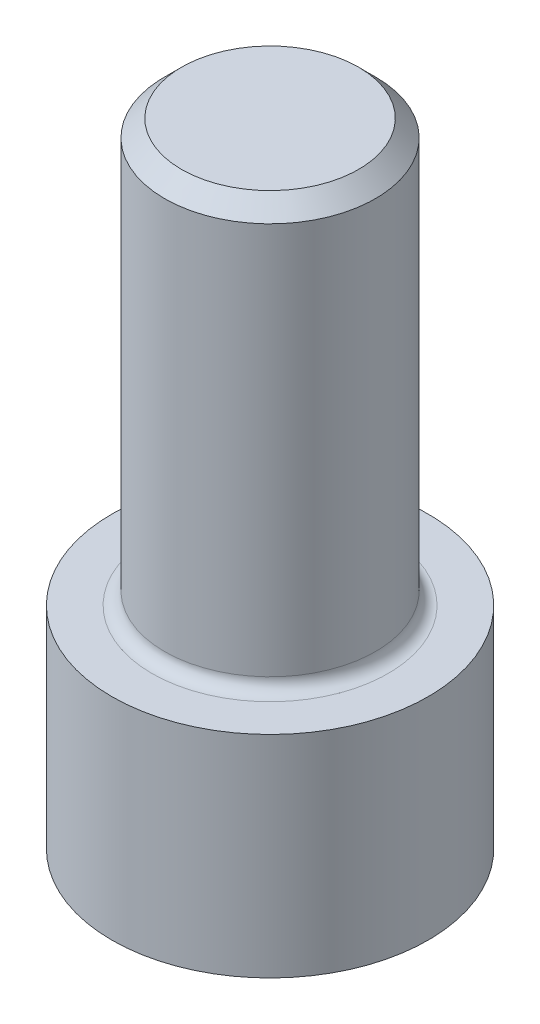
ISO-10303-21;
HEADER;
FILE_DESCRIPTION(('STEP AP214'),'2;1');
FILE_NAME('part.step','',(''),(''),'','','');
FILE_SCHEMA(('AUTOMOTIVE_DESIGN { 1 0 10303 214 1 1 1 1 }'));
ENDSEC;
DATA;
#1=APPLICATION_CONTEXT('core data for automotive mechanical design processes');
#2=APPLICATION_PROTOCOL_DEFINITION('international standard','automotive_design',2000,#1);
#3=PRODUCT_CONTEXT('',#1,'mechanical');
#4=PRODUCT('Part','Part','',(#3));
#5=PRODUCT_RELATED_PRODUCT_CATEGORY('part','',(#4));
#6=PRODUCT_DEFINITION_FORMATION('','',#4);
#7=PRODUCT_DEFINITION_CONTEXT('part definition',#1,'design');
#8=PRODUCT_DEFINITION('design','',#6,#7);
#9=PRODUCT_DEFINITION_SHAPE('','',#8);
#10=(LENGTH_UNIT() NAMED_UNIT(*) SI_UNIT(.MILLI.,.METRE.));
#11=(NAMED_UNIT(*) PLANE_ANGLE_UNIT() SI_UNIT($,.RADIAN.));
#12=(NAMED_UNIT(*) SI_UNIT($,.STERADIAN.) SOLID_ANGLE_UNIT());
#13=UNCERTAINTY_MEASURE_WITH_UNIT(LENGTH_MEASURE(1.E-05),#10,'distance_accuracy_value','');
#14=(GEOMETRIC_REPRESENTATION_CONTEXT(3) GLOBAL_UNCERTAINTY_ASSIGNED_CONTEXT((#13)) GLOBAL_UNIT_ASSIGNED_CONTEXT((#10,
#11,#12)) REPRESENTATION_CONTEXT('',''));
#15=CARTESIAN_POINT('',(0.,0.,0.));
#16=DIRECTION('',(0.,0.,1.));
#17=DIRECTION('',(1.,0.,0.));
#18=AXIS2_PLACEMENT_3D('',#15,#16,#17);
#19=CARTESIAN_POINT('',(0.,0.25,0.));
#20=DIRECTION('',(0.,-1.,0.));
#21=DIRECTION('',(0.,0.,-1.));
#22=AXIS2_PLACEMENT_3D('',#19,#20,#21);
#23=CYLINDRICAL_SURFACE('',#22,0.1875);
#24=CARTESIAN_POINT('',(0.,0.25,0.));
#25=DIRECTION('',(0.,1.,0.));
#26=DIRECTION('',(0.,0.,1.));
#27=AXIS2_PLACEMENT_3D('',#24,#25,#26);
#28=CIRCLE('',#27,0.1875);
#29=CARTESIAN_POINT('',(0.,0.25,0.1875));
#30=VERTEX_POINT('',#29);
#31=EDGE_CURVE('E167',#30,#30,#28,.T.);
#32=ORIENTED_EDGE('',*,*,#31,.F.);
#33=EDGE_LOOP('',(#32));
#34=FACE_BOUND('',#33,.T.);
#35=CARTESIAN_POINT('',(0.,0.,0.));
#36=DIRECTION('',(0.,1.,0.));
#37=DIRECTION('',(0.,0.,1.));
#38=AXIS2_PLACEMENT_3D('',#35,#36,#37);
#39=CIRCLE('',#38,0.1875);
#40=CARTESIAN_POINT('',(0.,0.,0.1875));
#41=VERTEX_POINT('',#40);
#42=EDGE_CURVE('E157',#41,#41,#39,.T.);
#43=ORIENTED_EDGE('',*,*,#42,.T.);
#44=EDGE_LOOP('',(#43));
#45=FACE_BOUND('',#44,.T.);
#46=ADVANCED_FACE('F41',(#34,#45),#23,.T.);
#47=CARTESIAN_POINT('',(0.,0.25,0.));
#48=DIRECTION('',(0.,1.,0.));
#49=DIRECTION('',(0.,0.,1.));
#50=AXIS2_PLACEMENT_3D('',#47,#48,#49);
#51=PLANE('',#50);
#52=CARTESIAN_POINT('',(0.,0.25,0.));
#53=DIRECTION('',(0.,1.,0.));
#54=DIRECTION('',(0.,0.,1.));
#55=AXIS2_PLACEMENT_3D('',#52,#53,#54);
#56=CIRCLE('',#55,0.14);
#57=CARTESIAN_POINT('',(0.,0.25,0.14));
#58=VERTEX_POINT('',#57);
#59=EDGE_CURVE('E178',#58,#58,#56,.F.);
#60=ORIENTED_EDGE('',*,*,#59,.T.);
#61=EDGE_LOOP('',(#60));
#62=FACE_BOUND('',#61,.T.);
#63=ORIENTED_EDGE('',*,*,#31,.T.);
#64=EDGE_LOOP('',(#63));
#65=FACE_BOUND('',#64,.T.);
#66=ADVANCED_FACE('F200',(#62,#65),#51,.T.);
#67=CARTESIAN_POINT('',(0.,0.,0.));
#68=DIRECTION('',(0.,1.,0.));
#69=DIRECTION('',(0.,0.,1.));
#70=AXIS2_PLACEMENT_3D('',#67,#68,#69);
#71=PLANE('',#70);
#72=DIRECTION('',(-0.0187363075382977,0.,0.999824459982766));
#73=VECTOR('',#72,1.);
#74=CARTESIAN_POINT('',(0.0875241535439282,0.,-0.0483686111690099));
#75=LINE('',#74,#73);
#76=CARTESIAN_POINT('',(0.0875241535439282,0.,-0.04836861116901));
#77=VERTEX_POINT('',#76);
#78=CARTESIAN_POINT('',(0.0856505227900985,0.,0.0516138348292667));
#79=VERTEX_POINT('',#78);
#80=EDGE_CURVE('E138',#77,#79,#75,.T.);
#81=ORIENTED_EDGE('',*,*,#80,.F.);
#82=DIRECTION('',(0.856505227900985,0.,0.516138348292667));
#83=VECTOR('',#82,1.);
#84=CARTESIAN_POINT('',(0.00187363075382977,0.,-0.0999824459982766));
#85=LINE('',#84,#83);
#86=CARTESIAN_POINT('',(0.00187363075382977,0.,-0.0999824459982766));
#87=VERTEX_POINT('',#86);
#88=EDGE_CURVE('E58',#87,#77,#85,.T.);
#89=ORIENTED_EDGE('',*,*,#88,.F.);
#90=DIRECTION('',(0.875241535439282,0.,-0.483686111690099));
#91=VECTOR('',#90,1.);
#92=CARTESIAN_POINT('',(-0.0856505227900985,0.,-0.0516138348292667));
#93=LINE('',#92,#91);
#94=CARTESIAN_POINT('',(-0.0856505227900985,0.,-0.0516138348292667));
#95=VERTEX_POINT('',#94);
#96=EDGE_CURVE('E151',#95,#87,#93,.T.);
#97=ORIENTED_EDGE('',*,*,#96,.F.);
#98=DIRECTION('',(0.0187363075382977,0.,-0.999824459982766));
#99=VECTOR('',#98,1.);
#100=CARTESIAN_POINT('',(-0.0875241535439282,0.,0.04836861116901));
#101=LINE('',#100,#99);
#102=CARTESIAN_POINT('',(-0.0875241535439282,0.,0.04836861116901));
#103=VERTEX_POINT('',#102);
#104=EDGE_CURVE('E148',#103,#95,#101,.T.);
#105=ORIENTED_EDGE('',*,*,#104,.F.);
#106=DIRECTION('',(-0.856505227900985,0.,-0.516138348292667));
#107=VECTOR('',#106,1.);
#108=CARTESIAN_POINT('',(-0.00187363075382976,0.,0.0999824459982766));
#109=LINE('',#108,#107);
#110=CARTESIAN_POINT('',(-0.00187363075382976,0.,0.0999824459982766));
#111=VERTEX_POINT('',#110);
#112=EDGE_CURVE('E106',#111,#103,#109,.T.);
#113=ORIENTED_EDGE('',*,*,#112,.F.);
#114=DIRECTION('',(-0.875241535439282,0.,0.4836861116901));
#115=VECTOR('',#114,1.);
#116=CARTESIAN_POINT('',(0.0856505227900985,0.,0.0516138348292667));
#117=LINE('',#116,#115);
#118=EDGE_CURVE('E142',#79,#111,#117,.T.);
#119=ORIENTED_EDGE('',*,*,#118,.F.);
#120=EDGE_LOOP('',(#81,#89,#97,#105,#113,#119));
#121=FACE_BOUND('',#120,.T.);
#122=ORIENTED_EDGE('',*,*,#42,.F.);
#123=EDGE_LOOP('',(#122));
#124=FACE_BOUND('',#123,.T.);
#125=ADVANCED_FACE('F206',(#121,#124),#71,.F.);
#126=CARTESIAN_POINT('',(0.,0.75,0.));
#127=DIRECTION('',(0.,-1.,0.));
#128=DIRECTION('',(0.,0.,-1.));
#129=AXIS2_PLACEMENT_3D('',#126,#127,#128);
#130=CYLINDRICAL_SURFACE('',#129,0.125);
#131=CARTESIAN_POINT('',(0.,0.73,0.));
#132=DIRECTION('',(0.,1.,0.));
#133=DIRECTION('',(0.,0.,1.));
#134=AXIS2_PLACEMENT_3D('',#131,#132,#133);
#135=CIRCLE('',#134,0.125);
#136=CARTESIAN_POINT('',(0.,0.73,0.125));
#137=VERTEX_POINT('',#136);
#138=EDGE_CURVE('E11',#137,#137,#135,.F.);
#139=ORIENTED_EDGE('',*,*,#138,.T.);
#140=EDGE_LOOP('',(#139));
#141=FACE_BOUND('',#140,.T.);
#142=CARTESIAN_POINT('',(0.,0.265,0.));
#143=DIRECTION('',(0.,1.,0.));
#144=DIRECTION('',(0.,0.,1.));
#145=AXIS2_PLACEMENT_3D('',#142,#143,#144);
#146=CIRCLE('',#145,0.125);
#147=CARTESIAN_POINT('',(0.,0.265,0.125));
#148=VERTEX_POINT('',#147);
#149=EDGE_CURVE('E171',#148,#148,#146,.T.);
#150=ORIENTED_EDGE('',*,*,#149,.T.);
#151=EDGE_LOOP('',(#150));
#152=FACE_BOUND('',#151,.T.);
#153=ADVANCED_FACE('F213',(#141,#152),#130,.T.);
#154=CARTESIAN_POINT('',(0.,0.75,0.));
#155=DIRECTION('',(0.,1.,0.));
#156=DIRECTION('',(0.,0.,1.));
#157=AXIS2_PLACEMENT_3D('',#154,#155,#156);
#158=PLANE('',#157);
#159=CARTESIAN_POINT('',(0.,0.75,0.));
#160=DIRECTION('',(0.,1.,0.));
#161=DIRECTION('',(0.,0.,1.));
#162=AXIS2_PLACEMENT_3D('',#159,#160,#161);
#163=CIRCLE('',#162,0.105);
#164=CARTESIAN_POINT('',(0.,0.75,0.105));
#165=VERTEX_POINT('',#164);
#166=EDGE_CURVE('E51',#165,#165,#163,.T.);
#167=ORIENTED_EDGE('',*,*,#166,.T.);
#168=EDGE_LOOP('',(#167));
#169=FACE_BOUND('',#168,.T.);
#170=ADVANCED_FACE('F185',(#169),#158,.T.);
#171=CARTESIAN_POINT('',(0.,0.265,0.));
#172=DIRECTION('',(0.,1.,0.));
#173=DIRECTION('',(0.,0.,1.));
#174=AXIS2_PLACEMENT_3D('',#171,#172,#173);
#175=TOROIDAL_SURFACE('',#174,0.14,0.015);
#176=ORIENTED_EDGE('',*,*,#59,.F.);
#177=EDGE_LOOP('',(#176));
#178=FACE_BOUND('',#177,.T.);
#179=ORIENTED_EDGE('',*,*,#149,.F.);
#180=EDGE_LOOP('',(#179));
#181=FACE_BOUND('',#180,.T.);
#182=ADVANCED_FACE('F189',(#178,#181),#175,.F.);
#183=CARTESIAN_POINT('',(0.,0.75,0.));
#184=DIRECTION('',(0.,-1.,0.));
#185=DIRECTION('',(0.,0.,-1.));
#186=AXIS2_PLACEMENT_3D('',#183,#184,#185);
#187=CONICAL_SURFACE('',#186,0.105,0.785398163397448);
#188=ORIENTED_EDGE('',*,*,#138,.F.);
#189=EDGE_LOOP('',(#188));
#190=FACE_BOUND('',#189,.T.);
#191=ORIENTED_EDGE('',*,*,#166,.F.);
#192=EDGE_LOOP('',(#191));
#193=FACE_BOUND('',#192,.T.);
#194=ADVANCED_FACE('F44',(#190,#193),#187,.T.);
#195=CARTESIAN_POINT('',(0.00187363075382977,0.15,-0.0999824459982766));
#196=DIRECTION('',(0.516138348292667,0.,-0.856505227900985));
#197=DIRECTION('',(-0.856505227900985,0.,-0.516138348292667));
#198=AXIS2_PLACEMENT_3D('',#195,#196,#197);
#199=PLANE('',#198);
#200=ORIENTED_EDGE('',*,*,#88,.T.);
#201=DIRECTION('',(0.,-1.,0.));
#202=VECTOR('',#201,1.);
#203=CARTESIAN_POINT('',(0.0875241535439282,0.15,-0.0483686111690099));
#204=LINE('',#203,#202);
#205=CARTESIAN_POINT('',(0.0875241535439282,0.15,-0.0483686111690099));
#206=VERTEX_POINT('',#205);
#207=EDGE_CURVE('E88',#206,#77,#204,.T.);
#208=ORIENTED_EDGE('',*,*,#207,.F.);
#209=DIRECTION('',(0.856505227900985,0.,0.516138348292667));
#210=VECTOR('',#209,1.);
#211=CARTESIAN_POINT('',(0.00187363075382977,0.15,-0.0999824459982766));
#212=LINE('',#211,#210);
#213=CARTESIAN_POINT('',(0.00187363075382977,0.15,-0.0999824459982766));
#214=VERTEX_POINT('',#213);
#215=EDGE_CURVE('E154',#214,#206,#212,.T.);
#216=ORIENTED_EDGE('',*,*,#215,.F.);
#217=DIRECTION('',(0.,-1.,0.));
#218=VECTOR('',#217,1.);
#219=CARTESIAN_POINT('',(0.00187363075382977,0.15,-0.0999824459982766));
#220=LINE('',#219,#218);
#221=EDGE_CURVE('E66',#214,#87,#220,.T.);
#222=ORIENTED_EDGE('',*,*,#221,.T.);
#223=EDGE_LOOP('',(#200,#208,#216,#222));
#224=FACE_BOUND('',#223,.T.);
#225=ADVANCED_FACE('F188',(#224),#199,.F.);
#226=CARTESIAN_POINT('',(-0.0856505227900985,0.15,-0.0516138348292667));
#227=DIRECTION('',(-0.4836861116901,0.,-0.875241535439282));
#228=DIRECTION('',(-0.875241535439282,0.,0.4836861116901));
#229=AXIS2_PLACEMENT_3D('',#226,#227,#228);
#230=PLANE('',#229);
#231=ORIENTED_EDGE('',*,*,#96,.T.);
#232=ORIENTED_EDGE('',*,*,#221,.F.);
#233=DIRECTION('',(0.875241535439282,0.,-0.483686111690099));
#234=VECTOR('',#233,1.);
#235=CARTESIAN_POINT('',(-0.0856505227900985,0.15,-0.0516138348292667));
#236=LINE('',#235,#234);
#237=CARTESIAN_POINT('',(-0.0856505227900985,0.15,-0.0516138348292667));
#238=VERTEX_POINT('',#237);
#239=EDGE_CURVE('E120',#238,#214,#236,.T.);
#240=ORIENTED_EDGE('',*,*,#239,.F.);
#241=DIRECTION('',(0.,-1.,0.));
#242=VECTOR('',#241,1.);
#243=CARTESIAN_POINT('',(-0.0856505227900985,0.15,-0.0516138348292667));
#244=LINE('',#243,#242);
#245=EDGE_CURVE('E111',#238,#95,#244,.T.);
#246=ORIENTED_EDGE('',*,*,#245,.T.);
#247=EDGE_LOOP('',(#231,#232,#240,#246));
#248=FACE_BOUND('',#247,.T.);
#249=ADVANCED_FACE('F195',(#248),#230,.F.);
#250=CARTESIAN_POINT('',(-0.0875241535439282,0.15,0.04836861116901));
#251=DIRECTION('',(-0.999824459982766,0.,-0.0187363075382977));
#252=DIRECTION('',(-0.0187363075382977,0.,0.999824459982766));
#253=AXIS2_PLACEMENT_3D('',#250,#251,#252);
#254=PLANE('',#253);
#255=ORIENTED_EDGE('',*,*,#104,.T.);
#256=ORIENTED_EDGE('',*,*,#245,.F.);
#257=DIRECTION('',(0.0187363075382977,0.,-0.999824459982766));
#258=VECTOR('',#257,1.);
#259=CARTESIAN_POINT('',(-0.0875241535439282,0.15,0.04836861116901));
#260=LINE('',#259,#258);
#261=CARTESIAN_POINT('',(-0.0875241535439282,0.15,0.04836861116901));
#262=VERTEX_POINT('',#261);
#263=EDGE_CURVE('E115',#262,#238,#260,.T.);
#264=ORIENTED_EDGE('',*,*,#263,.F.);
#265=DIRECTION('',(0.,-1.,0.));
#266=VECTOR('',#265,1.);
#267=CARTESIAN_POINT('',(-0.0875241535439282,0.15,0.04836861116901));
#268=LINE('',#267,#266);
#269=EDGE_CURVE('E99',#262,#103,#268,.T.);
#270=ORIENTED_EDGE('',*,*,#269,.T.);
#271=EDGE_LOOP('',(#255,#256,#264,#270));
#272=FACE_BOUND('',#271,.T.);
#273=ADVANCED_FACE('F116',(#272),#254,.F.);
#274=CARTESIAN_POINT('',(-0.00187363075382976,0.15,0.0999824459982766));
#275=DIRECTION('',(-0.516138348292667,0.,0.856505227900985));
#276=DIRECTION('',(0.856505227900985,0.,0.516138348292667));
#277=AXIS2_PLACEMENT_3D('',#274,#275,#276);
#278=PLANE('',#277);
#279=ORIENTED_EDGE('',*,*,#112,.T.);
#280=ORIENTED_EDGE('',*,*,#269,.F.);
#281=DIRECTION('',(-0.856505227900985,0.,-0.516138348292667));
#282=VECTOR('',#281,1.);
#283=CARTESIAN_POINT('',(-0.00187363075382976,0.15,0.0999824459982766));
#284=LINE('',#283,#282);
#285=CARTESIAN_POINT('',(-0.00187363075382976,0.15,0.0999824459982766));
#286=VERTEX_POINT('',#285);
#287=EDGE_CURVE('E103',#286,#262,#284,.T.);
#288=ORIENTED_EDGE('',*,*,#287,.F.);
#289=DIRECTION('',(0.,-1.,0.));
#290=VECTOR('',#289,1.);
#291=CARTESIAN_POINT('',(-0.00187363075382976,0.15,0.0999824459982766));
#292=LINE('',#291,#290);
#293=EDGE_CURVE('E112',#286,#111,#292,.T.);
#294=ORIENTED_EDGE('',*,*,#293,.T.);
#295=EDGE_LOOP('',(#279,#280,#288,#294));
#296=FACE_BOUND('',#295,.T.);
#297=ADVANCED_FACE('F101',(#296),#278,.F.);
#298=CARTESIAN_POINT('',(0.0856505227900985,0.15,0.0516138348292667));
#299=DIRECTION('',(0.4836861116901,0.,0.875241535439282));
#300=DIRECTION('',(0.875241535439282,0.,-0.4836861116901));
#301=AXIS2_PLACEMENT_3D('',#298,#299,#300);
#302=PLANE('',#301);
#303=ORIENTED_EDGE('',*,*,#118,.T.);
#304=ORIENTED_EDGE('',*,*,#293,.F.);
#305=DIRECTION('',(-0.875241535439282,0.,0.4836861116901));
#306=VECTOR('',#305,1.);
#307=CARTESIAN_POINT('',(0.0856505227900985,0.15,0.0516138348292667));
#308=LINE('',#307,#306);
#309=CARTESIAN_POINT('',(0.0856505227900985,0.15,0.0516138348292667));
#310=VERTEX_POINT('',#309);
#311=EDGE_CURVE('E126',#310,#286,#308,.T.);
#312=ORIENTED_EDGE('',*,*,#311,.F.);
#313=DIRECTION('',(0.,-1.,0.));
#314=VECTOR('',#313,1.);
#315=CARTESIAN_POINT('',(0.0856505227900985,0.15,0.0516138348292667));
#316=LINE('',#315,#314);
#317=EDGE_CURVE('E162',#310,#79,#316,.T.);
#318=ORIENTED_EDGE('',*,*,#317,.T.);
#319=EDGE_LOOP('',(#303,#304,#312,#318));
#320=FACE_BOUND('',#319,.T.);
#321=ADVANCED_FACE('F224',(#320),#302,.F.);
#322=CARTESIAN_POINT('',(0.0875241535439282,0.15,-0.0483686111690099));
#323=DIRECTION('',(0.999824459982766,0.,0.0187363075382977));
#324=DIRECTION('',(0.0187363075382977,0.,-0.999824459982766));
#325=AXIS2_PLACEMENT_3D('',#322,#323,#324);
#326=PLANE('',#325);
#327=ORIENTED_EDGE('',*,*,#80,.T.);
#328=ORIENTED_EDGE('',*,*,#317,.F.);
#329=DIRECTION('',(-0.0187363075382977,0.,0.999824459982766));
#330=VECTOR('',#329,1.);
#331=CARTESIAN_POINT('',(0.0875241535439282,0.15,-0.0483686111690099));
#332=LINE('',#331,#330);
#333=EDGE_CURVE('E130',#206,#310,#332,.T.);
#334=ORIENTED_EDGE('',*,*,#333,.F.);
#335=ORIENTED_EDGE('',*,*,#207,.T.);
#336=EDGE_LOOP('',(#327,#328,#334,#335));
#337=FACE_BOUND('',#336,.T.);
#338=ADVANCED_FACE('F221',(#337),#326,.F.);
#339=CARTESIAN_POINT('',(0.,0.15,0.));
#340=DIRECTION('',(0.,-1.,0.));
#341=DIRECTION('',(0.,0.,-1.));
#342=AXIS2_PLACEMENT_3D('',#339,#340,#341);
#343=PLANE('',#342);
#344=ORIENTED_EDGE('',*,*,#215,.T.);
#345=ORIENTED_EDGE('',*,*,#333,.T.);
#346=ORIENTED_EDGE('',*,*,#311,.T.);
#347=ORIENTED_EDGE('',*,*,#287,.T.);
#348=ORIENTED_EDGE('',*,*,#263,.T.);
#349=ORIENTED_EDGE('',*,*,#239,.T.);
#350=EDGE_LOOP('',(#344,#345,#346,#347,#348,#349));
#351=FACE_BOUND('',#350,.T.);
#352=ADVANCED_FACE('F123',(#351),#343,.T.);
#353=CLOSED_SHELL('',(#46,#66,#125,#153,#170,#182,#194,#225,#249,#273,#297,#321,#338,#352));
#354=MANIFOLD_SOLID_BREP('B2',#353);
#355=ADVANCED_BREP_SHAPE_REPRESENTATION('',(#18,#354),#14);
#356=SHAPE_DEFINITION_REPRESENTATION(#9,#355);
ENDSEC;
END-ISO-10303-21;
